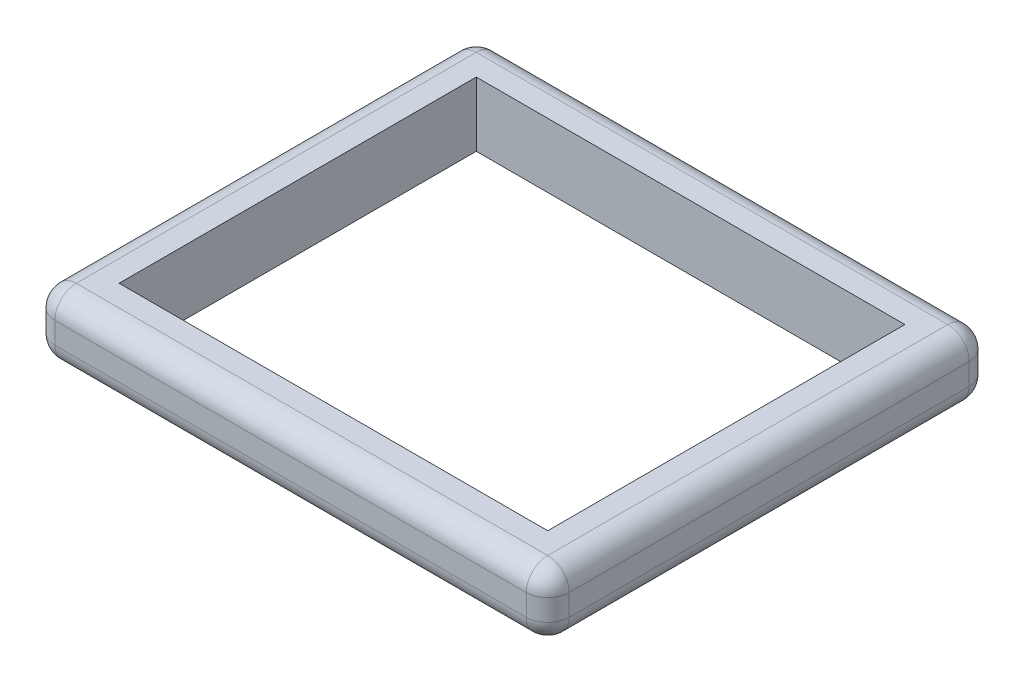
ISO-10303-21;
HEADER;
FILE_DESCRIPTION(('STEP AP214'),'2;1');
FILE_NAME('part.step','',(''),(''),'','','');
FILE_SCHEMA(('AUTOMOTIVE_DESIGN { 1 0 10303 214 1 1 1 1 }'));
ENDSEC;
DATA;
#1=APPLICATION_CONTEXT('core data for automotive mechanical design processes');
#2=APPLICATION_PROTOCOL_DEFINITION('international standard','automotive_design',2000,#1);
#3=PRODUCT_CONTEXT('',#1,'mechanical');
#4=PRODUCT('Part','Part','',(#3));
#5=PRODUCT_RELATED_PRODUCT_CATEGORY('part','',(#4));
#6=PRODUCT_DEFINITION_FORMATION('','',#4);
#7=PRODUCT_DEFINITION_CONTEXT('part definition',#1,'design');
#8=PRODUCT_DEFINITION('design','',#6,#7);
#9=PRODUCT_DEFINITION_SHAPE('','',#8);
#10=(LENGTH_UNIT() NAMED_UNIT(*) SI_UNIT(.MILLI.,.METRE.));
#11=(NAMED_UNIT(*) PLANE_ANGLE_UNIT() SI_UNIT($,.RADIAN.));
#12=(NAMED_UNIT(*) SI_UNIT($,.STERADIAN.) SOLID_ANGLE_UNIT());
#13=UNCERTAINTY_MEASURE_WITH_UNIT(LENGTH_MEASURE(1.E-05),#10,'distance_accuracy_value','');
#14=(GEOMETRIC_REPRESENTATION_CONTEXT(3) GLOBAL_UNCERTAINTY_ASSIGNED_CONTEXT((#13)) GLOBAL_UNIT_ASSIGNED_CONTEXT((#10,
#11,#12)) REPRESENTATION_CONTEXT('',''));
#15=CARTESIAN_POINT('',(0.,0.,0.));
#16=DIRECTION('',(0.,0.,1.));
#17=DIRECTION('',(1.,0.,0.));
#18=AXIS2_PLACEMENT_3D('',#15,#16,#17);
#19=CARTESIAN_POINT('',(0.,114.3,0.));
#20=DIRECTION('',(0.,1.,0.));
#21=DIRECTION('',(0.,0.,1.));
#22=AXIS2_PLACEMENT_3D('',#19,#20,#21);
#23=PLANE('',#22);
#24=DIRECTION('',(0.,0.,1.));
#25=VECTOR('',#24,1.);
#26=CARTESIAN_POINT('',(-419.1,114.3,355.6));
#27=LINE('',#26,#25);
#28=CARTESIAN_POINT('',(-419.1,114.3,-355.6));
#29=VERTEX_POINT('',#28);
#30=CARTESIAN_POINT('',(-419.1,114.3,355.6));
#31=VERTEX_POINT('',#30);
#32=EDGE_CURVE('E221',#29,#31,#27,.T.);
#33=ORIENTED_EDGE('',*,*,#32,.T.);
#34=DIRECTION('',(1.,0.,0.));
#35=VECTOR('',#34,1.);
#36=CARTESIAN_POINT('',(419.1,114.3,355.6));
#37=LINE('',#36,#35);
#38=CARTESIAN_POINT('',(419.1,114.3,355.6));
#39=VERTEX_POINT('',#38);
#40=EDGE_CURVE('E223',#31,#39,#37,.T.);
#41=ORIENTED_EDGE('',*,*,#40,.T.);
#42=DIRECTION('',(0.,0.,-1.));
#43=VECTOR('',#42,1.);
#44=CARTESIAN_POINT('',(419.1,114.3,-355.6));
#45=LINE('',#44,#43);
#46=CARTESIAN_POINT('',(419.1,114.3,-355.6));
#47=VERTEX_POINT('',#46);
#48=EDGE_CURVE('E217',#39,#47,#45,.T.);
#49=ORIENTED_EDGE('',*,*,#48,.T.);
#50=DIRECTION('',(-1.,0.,0.));
#51=VECTOR('',#50,1.);
#52=CARTESIAN_POINT('',(-419.1,114.3,-355.6));
#53=LINE('',#52,#51);
#54=EDGE_CURVE('E219',#47,#29,#53,.T.);
#55=ORIENTED_EDGE('',*,*,#54,.T.);
#56=EDGE_LOOP('',(#33,#41,#49,#55));
#57=FACE_BOUND('',#56,.T.);
#58=DIRECTION('',(-1.,0.,0.));
#59=VECTOR('',#58,1.);
#60=CARTESIAN_POINT('',(-381.,114.3,-317.5));
#61=LINE('',#60,#59);
#62=CARTESIAN_POINT('',(381.,114.3,-317.5));
#63=VERTEX_POINT('',#62);
#64=CARTESIAN_POINT('',(-381.,114.3,-317.5));
#65=VERTEX_POINT('',#64);
#66=EDGE_CURVE('E165',#63,#65,#61,.T.);
#67=ORIENTED_EDGE('',*,*,#66,.F.);
#68=DIRECTION('',(0.,0.,-1.));
#69=VECTOR('',#68,1.);
#70=CARTESIAN_POINT('',(381.,114.3,-317.5));
#71=LINE('',#70,#69);
#72=CARTESIAN_POINT('',(381.,114.3,317.5));
#73=VERTEX_POINT('',#72);
#74=EDGE_CURVE('E155',#73,#63,#71,.T.);
#75=ORIENTED_EDGE('',*,*,#74,.F.);
#76=DIRECTION('',(1.,0.,0.));
#77=VECTOR('',#76,1.);
#78=CARTESIAN_POINT('',(-381.,114.3,317.5));
#79=LINE('',#78,#77);
#80=CARTESIAN_POINT('',(-381.,114.3,317.5));
#81=VERTEX_POINT('',#80);
#82=EDGE_CURVE('E180',#81,#73,#79,.T.);
#83=ORIENTED_EDGE('',*,*,#82,.F.);
#84=DIRECTION('',(0.,0.,1.));
#85=VECTOR('',#84,1.);
#86=CARTESIAN_POINT('',(-381.,114.3,-317.5));
#87=LINE('',#86,#85);
#88=EDGE_CURVE('E178',#65,#81,#87,.T.);
#89=ORIENTED_EDGE('',*,*,#88,.F.);
#90=EDGE_LOOP('',(#67,#75,#83,#89));
#91=FACE_BOUND('',#90,.T.);
#92=ADVANCED_FACE('F40',(#57,#91),#23,.T.);
#93=CARTESIAN_POINT('',(0.,0.,0.));
#94=DIRECTION('',(0.,1.,0.));
#95=DIRECTION('',(0.,0.,1.));
#96=AXIS2_PLACEMENT_3D('',#93,#94,#95);
#97=PLANE('',#96);
#98=DIRECTION('',(0.,0.,-1.));
#99=VECTOR('',#98,1.);
#100=CARTESIAN_POINT('',(419.1,0.,0.));
#101=LINE('',#100,#99);
#102=CARTESIAN_POINT('',(419.1,0.,-355.6));
#103=VERTEX_POINT('',#102);
#104=CARTESIAN_POINT('',(419.1,0.,355.6));
#105=VERTEX_POINT('',#104);
#106=EDGE_CURVE('E270',#103,#105,#101,.F.);
#107=ORIENTED_EDGE('',*,*,#106,.T.);
#108=DIRECTION('',(1.,0.,0.));
#109=VECTOR('',#108,1.);
#110=CARTESIAN_POINT('',(0.,0.,355.6));
#111=LINE('',#110,#109);
#112=CARTESIAN_POINT('',(-419.1,0.,355.6));
#113=VERTEX_POINT('',#112);
#114=EDGE_CURVE('E276',#105,#113,#111,.F.);
#115=ORIENTED_EDGE('',*,*,#114,.T.);
#116=DIRECTION('',(0.,0.,1.));
#117=VECTOR('',#116,1.);
#118=CARTESIAN_POINT('',(-419.1,0.,0.));
#119=LINE('',#118,#117);
#120=CARTESIAN_POINT('',(-419.1,0.,-355.6));
#121=VERTEX_POINT('',#120);
#122=EDGE_CURVE('E274',#113,#121,#119,.F.);
#123=ORIENTED_EDGE('',*,*,#122,.T.);
#124=DIRECTION('',(-1.,0.,0.));
#125=VECTOR('',#124,1.);
#126=CARTESIAN_POINT('',(0.,0.,-355.6));
#127=LINE('',#126,#125);
#128=EDGE_CURVE('E272',#121,#103,#127,.F.);
#129=ORIENTED_EDGE('',*,*,#128,.T.);
#130=EDGE_LOOP('',(#107,#115,#123,#129));
#131=FACE_BOUND('',#130,.T.);
#132=DIRECTION('',(0.,0.,-1.));
#133=VECTOR('',#132,1.);
#134=CARTESIAN_POINT('',(381.,0.,-317.5));
#135=LINE('',#134,#133);
#136=CARTESIAN_POINT('',(381.,0.,317.5));
#137=VERTEX_POINT('',#136);
#138=CARTESIAN_POINT('',(381.,0.,-317.5));
#139=VERTEX_POINT('',#138);
#140=EDGE_CURVE('E184',#137,#139,#135,.T.);
#141=ORIENTED_EDGE('',*,*,#140,.T.);
#142=DIRECTION('',(-1.,0.,0.));
#143=VECTOR('',#142,1.);
#144=CARTESIAN_POINT('',(-381.,0.,-317.5));
#145=LINE('',#144,#143);
#146=CARTESIAN_POINT('',(-381.,0.,-317.5));
#147=VERTEX_POINT('',#146);
#148=EDGE_CURVE('E172',#139,#147,#145,.T.);
#149=ORIENTED_EDGE('',*,*,#148,.T.);
#150=DIRECTION('',(0.,0.,1.));
#151=VECTOR('',#150,1.);
#152=CARTESIAN_POINT('',(-381.,0.,-317.5));
#153=LINE('',#152,#151);
#154=CARTESIAN_POINT('',(-381.,0.,317.5));
#155=VERTEX_POINT('',#154);
#156=EDGE_CURVE('E188',#147,#155,#153,.T.);
#157=ORIENTED_EDGE('',*,*,#156,.T.);
#158=DIRECTION('',(1.,0.,0.));
#159=VECTOR('',#158,1.);
#160=CARTESIAN_POINT('',(-381.,0.,317.5));
#161=LINE('',#160,#159);
#162=EDGE_CURVE('E166',#155,#137,#161,.T.);
#163=ORIENTED_EDGE('',*,*,#162,.T.);
#164=EDGE_LOOP('',(#141,#149,#157,#163));
#165=FACE_BOUND('',#164,.T.);
#166=ADVANCED_FACE('F362',(#131,#165),#97,.F.);
#167=CARTESIAN_POINT('',(457.2,114.3,-393.7));
#168=DIRECTION('',(-1.,0.,0.));
#169=DIRECTION('',(0.,0.,1.));
#170=AXIS2_PLACEMENT_3D('',#167,#168,#169);
#171=PLANE('',#170);
#172=DIRECTION('',(0.,-1.,0.));
#173=VECTOR('',#172,1.);
#174=CARTESIAN_POINT('',(457.2,114.3,355.6));
#175=LINE('',#174,#173);
#176=CARTESIAN_POINT('',(457.2,76.2,355.6));
#177=VERTEX_POINT('',#176);
#178=CARTESIAN_POINT('',(457.2,38.1,355.6));
#179=VERTEX_POINT('',#178);
#180=EDGE_CURVE('E198',#177,#179,#175,.T.);
#181=ORIENTED_EDGE('',*,*,#180,.T.);
#182=DIRECTION('',(0.,0.,-1.));
#183=VECTOR('',#182,1.);
#184=CARTESIAN_POINT('',(457.2,38.1,-393.7));
#185=LINE('',#184,#183);
#186=CARTESIAN_POINT('',(457.2,38.1,-355.6));
#187=VERTEX_POINT('',#186);
#188=EDGE_CURVE('E11',#179,#187,#185,.T.);
#189=ORIENTED_EDGE('',*,*,#188,.T.);
#190=DIRECTION('',(0.,-1.,0.));
#191=VECTOR('',#190,1.);
#192=CARTESIAN_POINT('',(457.2,114.3,-355.6));
#193=LINE('',#192,#191);
#194=CARTESIAN_POINT('',(457.2,76.2,-355.6));
#195=VERTEX_POINT('',#194);
#196=EDGE_CURVE('E173',#187,#195,#193,.F.);
#197=ORIENTED_EDGE('',*,*,#196,.T.);
#198=DIRECTION('',(0.,0.,-1.));
#199=VECTOR('',#198,1.);
#200=CARTESIAN_POINT('',(457.2,76.2,355.6));
#201=LINE('',#200,#199);
#202=EDGE_CURVE('E241',#195,#177,#201,.F.);
#203=ORIENTED_EDGE('',*,*,#202,.T.);
#204=EDGE_LOOP('',(#181,#189,#197,#203));
#205=FACE_BOUND('',#204,.T.);
#206=ADVANCED_FACE('F368',(#205),#171,.F.);
#207=CARTESIAN_POINT('',(-457.2,114.3,-393.7));
#208=DIRECTION('',(0.,0.,1.));
#209=DIRECTION('',(1.,0.,0.));
#210=AXIS2_PLACEMENT_3D('',#207,#208,#209);
#211=PLANE('',#210);
#212=DIRECTION('',(0.,-1.,0.));
#213=VECTOR('',#212,1.);
#214=CARTESIAN_POINT('',(419.1,114.3,-393.7));
#215=LINE('',#214,#213);
#216=CARTESIAN_POINT('',(419.1,76.2,-393.7));
#217=VERTEX_POINT('',#216);
#218=CARTESIAN_POINT('',(419.1,38.1,-393.7));
#219=VERTEX_POINT('',#218);
#220=EDGE_CURVE('E210',#217,#219,#215,.T.);
#221=ORIENTED_EDGE('',*,*,#220,.T.);
#222=DIRECTION('',(-1.,0.,0.));
#223=VECTOR('',#222,1.);
#224=CARTESIAN_POINT('',(-457.2,38.1,-393.7));
#225=LINE('',#224,#223);
#226=CARTESIAN_POINT('',(-419.1,38.1,-393.7));
#227=VERTEX_POINT('',#226);
#228=EDGE_CURVE('E285',#219,#227,#225,.T.);
#229=ORIENTED_EDGE('',*,*,#228,.T.);
#230=DIRECTION('',(0.,-1.,0.));
#231=VECTOR('',#230,1.);
#232=CARTESIAN_POINT('',(-419.1,114.3,-393.7));
#233=LINE('',#232,#231);
#234=CARTESIAN_POINT('',(-419.1,76.2,-393.7));
#235=VERTEX_POINT('',#234);
#236=EDGE_CURVE('E212',#227,#235,#233,.F.);
#237=ORIENTED_EDGE('',*,*,#236,.T.);
#238=DIRECTION('',(-1.,0.,0.));
#239=VECTOR('',#238,1.);
#240=CARTESIAN_POINT('',(419.1,76.2,-393.7));
#241=LINE('',#240,#239);
#242=EDGE_CURVE('E236',#235,#217,#241,.F.);
#243=ORIENTED_EDGE('',*,*,#242,.T.);
#244=EDGE_LOOP('',(#221,#229,#237,#243));
#245=FACE_BOUND('',#244,.T.);
#246=ADVANCED_FACE('F380',(#245),#211,.F.);
#247=CARTESIAN_POINT('',(-457.2,114.3,-393.7));
#248=DIRECTION('',(1.,0.,0.));
#249=DIRECTION('',(0.,0.,-1.));
#250=AXIS2_PLACEMENT_3D('',#247,#248,#249);
#251=PLANE('',#250);
#252=DIRECTION('',(0.,-1.,0.));
#253=VECTOR('',#252,1.);
#254=CARTESIAN_POINT('',(-457.2,114.3,-355.6));
#255=LINE('',#254,#253);
#256=CARTESIAN_POINT('',(-457.2,76.2,-355.6));
#257=VERTEX_POINT('',#256);
#258=CARTESIAN_POINT('',(-457.2,38.1,-355.6));
#259=VERTEX_POINT('',#258);
#260=EDGE_CURVE('E205',#257,#259,#255,.T.);
#261=ORIENTED_EDGE('',*,*,#260,.T.);
#262=DIRECTION('',(0.,0.,1.));
#263=VECTOR('',#262,1.);
#264=CARTESIAN_POINT('',(-457.2,38.1,-393.7));
#265=LINE('',#264,#263);
#266=CARTESIAN_POINT('',(-457.2,38.1,355.6));
#267=VERTEX_POINT('',#266);
#268=EDGE_CURVE('E281',#259,#267,#265,.T.);
#269=ORIENTED_EDGE('',*,*,#268,.T.);
#270=DIRECTION('',(0.,-1.,0.));
#271=VECTOR('',#270,1.);
#272=CARTESIAN_POINT('',(-457.2,114.3,355.6));
#273=LINE('',#272,#271);
#274=CARTESIAN_POINT('',(-457.2,76.2,355.6));
#275=VERTEX_POINT('',#274);
#276=EDGE_CURVE('E208',#267,#275,#273,.F.);
#277=ORIENTED_EDGE('',*,*,#276,.T.);
#278=DIRECTION('',(0.,0.,1.));
#279=VECTOR('',#278,1.);
#280=CARTESIAN_POINT('',(-457.2,76.2,-355.6));
#281=LINE('',#280,#279);
#282=EDGE_CURVE('E231',#275,#257,#281,.F.);
#283=ORIENTED_EDGE('',*,*,#282,.T.);
#284=EDGE_LOOP('',(#261,#269,#277,#283));
#285=FACE_BOUND('',#284,.T.);
#286=ADVANCED_FACE('F324',(#285),#251,.F.);
#287=CARTESIAN_POINT('',(-457.2,114.3,393.7));
#288=DIRECTION('',(0.,0.,-1.));
#289=DIRECTION('',(-1.,0.,0.));
#290=AXIS2_PLACEMENT_3D('',#287,#288,#289);
#291=PLANE('',#290);
#292=DIRECTION('',(0.,-1.,0.));
#293=VECTOR('',#292,1.);
#294=CARTESIAN_POINT('',(-419.1,114.3,393.7));
#295=LINE('',#294,#293);
#296=CARTESIAN_POINT('',(-419.1,76.2,393.7));
#297=VERTEX_POINT('',#296);
#298=CARTESIAN_POINT('',(-419.1,38.1,393.7));
#299=VERTEX_POINT('',#298);
#300=EDGE_CURVE('E200',#297,#299,#295,.T.);
#301=ORIENTED_EDGE('',*,*,#300,.T.);
#302=DIRECTION('',(1.,0.,0.));
#303=VECTOR('',#302,1.);
#304=CARTESIAN_POINT('',(-457.2,38.1,393.7));
#305=LINE('',#304,#303);
#306=CARTESIAN_POINT('',(419.1,38.1,393.7));
#307=VERTEX_POINT('',#306);
#308=EDGE_CURVE('E268',#299,#307,#305,.T.);
#309=ORIENTED_EDGE('',*,*,#308,.T.);
#310=DIRECTION('',(0.,-1.,0.));
#311=VECTOR('',#310,1.);
#312=CARTESIAN_POINT('',(419.1,114.3,393.7));
#313=LINE('',#312,#311);
#314=CARTESIAN_POINT('',(419.1,76.2,393.7));
#315=VERTEX_POINT('',#314);
#316=EDGE_CURVE('E203',#307,#315,#313,.F.);
#317=ORIENTED_EDGE('',*,*,#316,.T.);
#318=DIRECTION('',(1.,0.,0.));
#319=VECTOR('',#318,1.);
#320=CARTESIAN_POINT('',(-419.1,76.2,393.7));
#321=LINE('',#320,#319);
#322=EDGE_CURVE('E226',#315,#297,#321,.F.);
#323=ORIENTED_EDGE('',*,*,#322,.T.);
#324=EDGE_LOOP('',(#301,#309,#317,#323));
#325=FACE_BOUND('',#324,.T.);
#326=ADVANCED_FACE('F374',(#325),#291,.F.);
#327=CARTESIAN_POINT('',(381.,114.3,-317.5));
#328=DIRECTION('',(-1.,0.,0.));
#329=DIRECTION('',(0.,0.,1.));
#330=AXIS2_PLACEMENT_3D('',#327,#328,#329);
#331=PLANE('',#330);
#332=ORIENTED_EDGE('',*,*,#140,.F.);
#333=DIRECTION('',(0.,-1.,0.));
#334=VECTOR('',#333,1.);
#335=CARTESIAN_POINT('',(381.,114.3,317.5));
#336=LINE('',#335,#334);
#337=EDGE_CURVE('E161',#73,#137,#336,.T.);
#338=ORIENTED_EDGE('',*,*,#337,.F.);
#339=ORIENTED_EDGE('',*,*,#74,.T.);
#340=DIRECTION('',(0.,-1.,0.));
#341=VECTOR('',#340,1.);
#342=CARTESIAN_POINT('',(381.,114.3,-317.5));
#343=LINE('',#342,#341);
#344=EDGE_CURVE('E158',#63,#139,#343,.T.);
#345=ORIENTED_EDGE('',*,*,#344,.T.);
#346=EDGE_LOOP('',(#332,#338,#339,#345));
#347=FACE_BOUND('',#346,.T.);
#348=ADVANCED_FACE('F157',(#347),#331,.T.);
#349=CARTESIAN_POINT('',(-381.,114.3,-317.5));
#350=DIRECTION('',(0.,0.,1.));
#351=DIRECTION('',(1.,0.,0.));
#352=AXIS2_PLACEMENT_3D('',#349,#350,#351);
#353=PLANE('',#352);
#354=ORIENTED_EDGE('',*,*,#148,.F.);
#355=ORIENTED_EDGE('',*,*,#344,.F.);
#356=ORIENTED_EDGE('',*,*,#66,.T.);
#357=DIRECTION('',(0.,-1.,0.));
#358=VECTOR('',#357,1.);
#359=CARTESIAN_POINT('',(-381.,114.3,-317.5));
#360=LINE('',#359,#358);
#361=EDGE_CURVE('E174',#65,#147,#360,.T.);
#362=ORIENTED_EDGE('',*,*,#361,.T.);
#363=EDGE_LOOP('',(#354,#355,#356,#362));
#364=FACE_BOUND('',#363,.T.);
#365=ADVANCED_FACE('F169',(#364),#353,.T.);
#366=CARTESIAN_POINT('',(-381.,114.3,-317.5));
#367=DIRECTION('',(1.,0.,0.));
#368=DIRECTION('',(0.,0.,-1.));
#369=AXIS2_PLACEMENT_3D('',#366,#367,#368);
#370=PLANE('',#369);
#371=ORIENTED_EDGE('',*,*,#156,.F.);
#372=ORIENTED_EDGE('',*,*,#361,.F.);
#373=ORIENTED_EDGE('',*,*,#88,.T.);
#374=DIRECTION('',(0.,-1.,0.));
#375=VECTOR('',#374,1.);
#376=CARTESIAN_POINT('',(-381.,114.3,317.5));
#377=LINE('',#376,#375);
#378=EDGE_CURVE('E194',#81,#155,#377,.T.);
#379=ORIENTED_EDGE('',*,*,#378,.T.);
#380=EDGE_LOOP('',(#371,#372,#373,#379));
#381=FACE_BOUND('',#380,.T.);
#382=ADVANCED_FACE('F602',(#381),#370,.T.);
#383=CARTESIAN_POINT('',(-381.,114.3,317.5));
#384=DIRECTION('',(0.,0.,-1.));
#385=DIRECTION('',(-1.,0.,0.));
#386=AXIS2_PLACEMENT_3D('',#383,#384,#385);
#387=PLANE('',#386);
#388=ORIENTED_EDGE('',*,*,#162,.F.);
#389=ORIENTED_EDGE('',*,*,#378,.F.);
#390=ORIENTED_EDGE('',*,*,#82,.T.);
#391=ORIENTED_EDGE('',*,*,#337,.T.);
#392=EDGE_LOOP('',(#388,#389,#390,#391));
#393=FACE_BOUND('',#392,.T.);
#394=ADVANCED_FACE('F390',(#393),#387,.T.);
#395=CARTESIAN_POINT('',(419.1,114.3,355.6));
#396=DIRECTION('',(0.,-1.,0.));
#397=DIRECTION('',(0.,0.,-1.));
#398=AXIS2_PLACEMENT_3D('',#395,#396,#397);
#399=CYLINDRICAL_SURFACE('',#398,38.1);
#400=ORIENTED_EDGE('',*,*,#316,.F.);
#401=CARTESIAN_POINT('',(419.1,38.1,355.6));
#402=DIRECTION('',(0.,-1.,0.));
#403=DIRECTION('',(0.,0.,-1.));
#404=AXIS2_PLACEMENT_3D('',#401,#402,#403);
#405=CIRCLE('',#404,38.1);
#406=EDGE_CURVE('E243',#307,#179,#405,.F.);
#407=ORIENTED_EDGE('',*,*,#406,.T.);
#408=ORIENTED_EDGE('',*,*,#180,.F.);
#409=CARTESIAN_POINT('',(419.1,76.2,355.6));
#410=DIRECTION('',(0.,-1.,0.));
#411=DIRECTION('',(0.,0.,-1.));
#412=AXIS2_PLACEMENT_3D('',#409,#410,#411);
#413=CIRCLE('',#412,38.1);
#414=EDGE_CURVE('E214',#177,#315,#413,.T.);
#415=ORIENTED_EDGE('',*,*,#414,.T.);
#416=EDGE_LOOP('',(#400,#407,#408,#415));
#417=FACE_BOUND('',#416,.T.);
#418=ADVANCED_FACE('F386',(#417),#399,.T.);
#419=CARTESIAN_POINT('',(-419.1,114.3,355.6));
#420=DIRECTION('',(0.,-1.,0.));
#421=DIRECTION('',(0.,0.,-1.));
#422=AXIS2_PLACEMENT_3D('',#419,#420,#421);
#423=CYLINDRICAL_SURFACE('',#422,38.1);
#424=ORIENTED_EDGE('',*,*,#276,.F.);
#425=CARTESIAN_POINT('',(-419.1,38.1,355.6));
#426=DIRECTION('',(0.,-1.,0.));
#427=DIRECTION('',(0.,0.,-1.));
#428=AXIS2_PLACEMENT_3D('',#425,#426,#427);
#429=CIRCLE('',#428,38.1);
#430=EDGE_CURVE('E279',#267,#299,#429,.F.);
#431=ORIENTED_EDGE('',*,*,#430,.T.);
#432=ORIENTED_EDGE('',*,*,#300,.F.);
#433=CARTESIAN_POINT('',(-419.1,76.2,355.6));
#434=DIRECTION('',(0.,-1.,0.));
#435=DIRECTION('',(0.,0.,-1.));
#436=AXIS2_PLACEMENT_3D('',#433,#434,#435);
#437=CIRCLE('',#436,38.1);
#438=EDGE_CURVE('E228',#297,#275,#437,.T.);
#439=ORIENTED_EDGE('',*,*,#438,.T.);
#440=EDGE_LOOP('',(#424,#431,#432,#439));
#441=FACE_BOUND('',#440,.T.);
#442=ADVANCED_FACE('F389',(#441),#423,.T.);
#443=CARTESIAN_POINT('',(-419.1,114.3,-355.6));
#444=DIRECTION('',(0.,-1.,0.));
#445=DIRECTION('',(0.,0.,-1.));
#446=AXIS2_PLACEMENT_3D('',#443,#444,#445);
#447=CYLINDRICAL_SURFACE('',#446,38.1);
#448=ORIENTED_EDGE('',*,*,#236,.F.);
#449=CARTESIAN_POINT('',(-419.1,38.1,-355.6));
#450=DIRECTION('',(0.,-1.,0.));
#451=DIRECTION('',(0.,0.,-1.));
#452=AXIS2_PLACEMENT_3D('',#449,#450,#451);
#453=CIRCLE('',#452,38.1);
#454=EDGE_CURVE('E283',#227,#259,#453,.F.);
#455=ORIENTED_EDGE('',*,*,#454,.T.);
#456=ORIENTED_EDGE('',*,*,#260,.F.);
#457=CARTESIAN_POINT('',(-419.1,76.2,-355.6));
#458=DIRECTION('',(0.,-1.,0.));
#459=DIRECTION('',(0.,0.,-1.));
#460=AXIS2_PLACEMENT_3D('',#457,#458,#459);
#461=CIRCLE('',#460,38.1);
#462=EDGE_CURVE('E233',#257,#235,#461,.T.);
#463=ORIENTED_EDGE('',*,*,#462,.T.);
#464=EDGE_LOOP('',(#448,#455,#456,#463));
#465=FACE_BOUND('',#464,.T.);
#466=ADVANCED_FACE('F321',(#465),#447,.T.);
#467=CARTESIAN_POINT('',(419.1,114.3,-355.6));
#468=DIRECTION('',(0.,-1.,0.));
#469=DIRECTION('',(0.,0.,-1.));
#470=AXIS2_PLACEMENT_3D('',#467,#468,#469);
#471=CYLINDRICAL_SURFACE('',#470,38.1);
#472=ORIENTED_EDGE('',*,*,#196,.F.);
#473=CARTESIAN_POINT('',(419.1,38.1,-355.6));
#474=DIRECTION('',(0.,-1.,0.));
#475=DIRECTION('',(0.,0.,-1.));
#476=AXIS2_PLACEMENT_3D('',#473,#474,#475);
#477=CIRCLE('',#476,38.1);
#478=EDGE_CURVE('E49',#187,#219,#477,.F.);
#479=ORIENTED_EDGE('',*,*,#478,.T.);
#480=ORIENTED_EDGE('',*,*,#220,.F.);
#481=CARTESIAN_POINT('',(419.1,76.2,-355.6));
#482=DIRECTION('',(0.,-1.,0.));
#483=DIRECTION('',(0.,0.,-1.));
#484=AXIS2_PLACEMENT_3D('',#481,#482,#483);
#485=CIRCLE('',#484,38.1);
#486=EDGE_CURVE('E238',#217,#195,#485,.T.);
#487=ORIENTED_EDGE('',*,*,#486,.T.);
#488=EDGE_LOOP('',(#472,#479,#480,#487));
#489=FACE_BOUND('',#488,.T.);
#490=ADVANCED_FACE('F352',(#489),#471,.T.);
#491=CARTESIAN_POINT('',(-419.1,76.2,-355.6));
#492=DIRECTION('',(0.,1.,0.));
#493=DIRECTION('',(0.,0.,1.));
#494=AXIS2_PLACEMENT_3D('',#491,#492,#493);
#495=SPHERICAL_SURFACE('',#494,38.1);
#496=CARTESIAN_POINT('',(-419.1,76.2,-355.6));
#497=DIRECTION('',(1.,0.,0.));
#498=DIRECTION('',(0.,0.,-1.));
#499=AXIS2_PLACEMENT_3D('',#496,#497,#498);
#500=CIRCLE('',#499,38.1);
#501=EDGE_CURVE('E261',#235,#29,#500,.T.);
#502=ORIENTED_EDGE('',*,*,#501,.F.);
#503=ORIENTED_EDGE('',*,*,#462,.F.);
#504=CARTESIAN_POINT('',(-419.1,76.2,-355.6));
#505=DIRECTION('',(0.,0.,1.));
#506=DIRECTION('',(1.,0.,0.));
#507=AXIS2_PLACEMENT_3D('',#504,#505,#506);
#508=CIRCLE('',#507,38.1);
#509=EDGE_CURVE('E186',#29,#257,#508,.T.);
#510=ORIENTED_EDGE('',*,*,#509,.F.);
#511=EDGE_LOOP('',(#502,#503,#510));
#512=FACE_BOUND('',#511,.T.);
#513=ADVANCED_FACE('F350',(#512),#495,.T.);
#514=CARTESIAN_POINT('',(-419.1,76.2,0.));
#515=DIRECTION('',(0.,0.,-1.));
#516=DIRECTION('',(-1.,0.,0.));
#517=AXIS2_PLACEMENT_3D('',#514,#515,#516);
#518=CYLINDRICAL_SURFACE('',#517,38.1);
#519=ORIENTED_EDGE('',*,*,#509,.T.);
#520=ORIENTED_EDGE('',*,*,#282,.F.);
#521=CARTESIAN_POINT('',(-419.1,76.2,355.6));
#522=DIRECTION('',(0.,0.,1.));
#523=DIRECTION('',(1.,0.,0.));
#524=AXIS2_PLACEMENT_3D('',#521,#522,#523);
#525=CIRCLE('',#524,38.1);
#526=EDGE_CURVE('E258',#31,#275,#525,.T.);
#527=ORIENTED_EDGE('',*,*,#526,.F.);
#528=ORIENTED_EDGE('',*,*,#32,.F.);
#529=EDGE_LOOP('',(#519,#520,#527,#528));
#530=FACE_BOUND('',#529,.T.);
#531=ADVANCED_FACE('F329',(#530),#518,.T.);
#532=CARTESIAN_POINT('',(0.,76.2,-355.6));
#533=DIRECTION('',(1.,0.,0.));
#534=DIRECTION('',(0.,0.,-1.));
#535=AXIS2_PLACEMENT_3D('',#532,#533,#534);
#536=CYLINDRICAL_SURFACE('',#535,38.1);
#537=ORIENTED_EDGE('',*,*,#501,.T.);
#538=ORIENTED_EDGE('',*,*,#54,.F.);
#539=CARTESIAN_POINT('',(419.1,76.2,-355.6));
#540=DIRECTION('',(1.,0.,0.));
#541=DIRECTION('',(0.,0.,-1.));
#542=AXIS2_PLACEMENT_3D('',#539,#540,#541);
#543=CIRCLE('',#542,38.1);
#544=EDGE_CURVE('E255',#217,#47,#543,.T.);
#545=ORIENTED_EDGE('',*,*,#544,.F.);
#546=ORIENTED_EDGE('',*,*,#242,.F.);
#547=EDGE_LOOP('',(#537,#538,#545,#546));
#548=FACE_BOUND('',#547,.T.);
#549=ADVANCED_FACE('F348',(#548),#536,.T.);
#550=CARTESIAN_POINT('',(-419.1,76.2,355.6));
#551=DIRECTION('',(0.,1.,0.));
#552=DIRECTION('',(0.,0.,1.));
#553=AXIS2_PLACEMENT_3D('',#550,#551,#552);
#554=SPHERICAL_SURFACE('',#553,38.1);
#555=ORIENTED_EDGE('',*,*,#526,.T.);
#556=ORIENTED_EDGE('',*,*,#438,.F.);
#557=CARTESIAN_POINT('',(-419.1,76.2,355.6));
#558=DIRECTION('',(1.,0.,0.));
#559=DIRECTION('',(0.,0.,-1.));
#560=AXIS2_PLACEMENT_3D('',#557,#558,#559);
#561=CIRCLE('',#560,38.1);
#562=EDGE_CURVE('E252',#31,#297,#561,.T.);
#563=ORIENTED_EDGE('',*,*,#562,.F.);
#564=EDGE_LOOP('',(#555,#556,#563));
#565=FACE_BOUND('',#564,.T.);
#566=ADVANCED_FACE('F335',(#565),#554,.T.);
#567=CARTESIAN_POINT('',(419.1,76.2,-355.6));
#568=DIRECTION('',(0.,1.,0.));
#569=DIRECTION('',(0.,0.,1.));
#570=AXIS2_PLACEMENT_3D('',#567,#568,#569);
#571=SPHERICAL_SURFACE('',#570,38.1);
#572=ORIENTED_EDGE('',*,*,#486,.F.);
#573=ORIENTED_EDGE('',*,*,#544,.T.);
#574=CARTESIAN_POINT('',(419.1,76.2,-355.6));
#575=DIRECTION('',(0.,0.,1.));
#576=DIRECTION('',(1.,0.,0.));
#577=AXIS2_PLACEMENT_3D('',#574,#575,#576);
#578=CIRCLE('',#577,38.1);
#579=EDGE_CURVE('E249',#195,#47,#578,.T.);
#580=ORIENTED_EDGE('',*,*,#579,.F.);
#581=EDGE_LOOP('',(#572,#573,#580));
#582=FACE_BOUND('',#581,.T.);
#583=ADVANCED_FACE('F407',(#582),#571,.T.);
#584=CARTESIAN_POINT('',(0.,76.2,355.6));
#585=DIRECTION('',(-1.,0.,0.));
#586=DIRECTION('',(0.,0.,1.));
#587=AXIS2_PLACEMENT_3D('',#584,#585,#586);
#588=CYLINDRICAL_SURFACE('',#587,38.1);
#589=ORIENTED_EDGE('',*,*,#562,.T.);
#590=ORIENTED_EDGE('',*,*,#322,.F.);
#591=CARTESIAN_POINT('',(419.1,76.2,355.6));
#592=DIRECTION('',(1.,0.,0.));
#593=DIRECTION('',(0.,0.,-1.));
#594=AXIS2_PLACEMENT_3D('',#591,#592,#593);
#595=CIRCLE('',#594,38.1);
#596=EDGE_CURVE('E246',#39,#315,#595,.T.);
#597=ORIENTED_EDGE('',*,*,#596,.F.);
#598=ORIENTED_EDGE('',*,*,#40,.F.);
#599=EDGE_LOOP('',(#589,#590,#597,#598));
#600=FACE_BOUND('',#599,.T.);
#601=ADVANCED_FACE('F340',(#600),#588,.T.);
#602=CARTESIAN_POINT('',(419.1,76.2,0.));
#603=DIRECTION('',(0.,0.,1.));
#604=DIRECTION('',(1.,0.,0.));
#605=AXIS2_PLACEMENT_3D('',#602,#603,#604);
#606=CYLINDRICAL_SURFACE('',#605,38.1);
#607=ORIENTED_EDGE('',*,*,#579,.T.);
#608=ORIENTED_EDGE('',*,*,#48,.F.);
#609=CARTESIAN_POINT('',(419.1,76.2,355.6));
#610=DIRECTION('',(0.,0.,1.));
#611=DIRECTION('',(1.,0.,0.));
#612=AXIS2_PLACEMENT_3D('',#609,#610,#611);
#613=CIRCLE('',#612,38.1);
#614=EDGE_CURVE('E244',#177,#39,#613,.T.);
#615=ORIENTED_EDGE('',*,*,#614,.F.);
#616=ORIENTED_EDGE('',*,*,#202,.F.);
#617=EDGE_LOOP('',(#607,#608,#615,#616));
#618=FACE_BOUND('',#617,.T.);
#619=ADVANCED_FACE('F400',(#618),#606,.T.);
#620=CARTESIAN_POINT('',(419.1,76.2,355.6));
#621=DIRECTION('',(0.,1.,0.));
#622=DIRECTION('',(0.,0.,1.));
#623=AXIS2_PLACEMENT_3D('',#620,#621,#622);
#624=SPHERICAL_SURFACE('',#623,38.1);
#625=ORIENTED_EDGE('',*,*,#596,.T.);
#626=ORIENTED_EDGE('',*,*,#414,.F.);
#627=ORIENTED_EDGE('',*,*,#614,.T.);
#628=EDGE_LOOP('',(#625,#626,#627));
#629=FACE_BOUND('',#628,.T.);
#630=ADVANCED_FACE('F397',(#629),#624,.T.);
#631=CARTESIAN_POINT('',(-419.1,38.1,-355.6));
#632=DIRECTION('',(0.,1.,0.));
#633=DIRECTION('',(0.,0.,1.));
#634=AXIS2_PLACEMENT_3D('',#631,#632,#633);
#635=SPHERICAL_SURFACE('',#634,38.1);
#636=CARTESIAN_POINT('',(-419.1,38.1,-355.6));
#637=DIRECTION('',(0.,0.,1.));
#638=DIRECTION('',(1.,0.,0.));
#639=AXIS2_PLACEMENT_3D('',#636,#637,#638);
#640=CIRCLE('',#639,38.1);
#641=EDGE_CURVE('E303',#259,#121,#640,.T.);
#642=ORIENTED_EDGE('',*,*,#641,.F.);
#643=ORIENTED_EDGE('',*,*,#454,.F.);
#644=CARTESIAN_POINT('',(-419.1,38.1,-355.6));
#645=DIRECTION('',(1.,0.,0.));
#646=DIRECTION('',(0.,0.,-1.));
#647=AXIS2_PLACEMENT_3D('',#644,#645,#646);
#648=CIRCLE('',#647,38.1);
#649=EDGE_CURVE('E44',#121,#227,#648,.T.);
#650=ORIENTED_EDGE('',*,*,#649,.F.);
#651=EDGE_LOOP('',(#642,#643,#650));
#652=FACE_BOUND('',#651,.T.);
#653=ADVANCED_FACE('F42',(#652),#635,.T.);
#654=CARTESIAN_POINT('',(-457.2,38.1,-355.6));
#655=DIRECTION('',(-1.,0.,0.));
#656=DIRECTION('',(0.,0.,1.));
#657=AXIS2_PLACEMENT_3D('',#654,#655,#656);
#658=CYLINDRICAL_SURFACE('',#657,38.1);
#659=ORIENTED_EDGE('',*,*,#649,.T.);
#660=ORIENTED_EDGE('',*,*,#228,.F.);
#661=CARTESIAN_POINT('',(419.1,38.1,-355.6));
#662=DIRECTION('',(1.,0.,0.));
#663=DIRECTION('',(0.,0.,-1.));
#664=AXIS2_PLACEMENT_3D('',#661,#662,#663);
#665=CIRCLE('',#664,38.1);
#666=EDGE_CURVE('E301',#103,#219,#665,.T.);
#667=ORIENTED_EDGE('',*,*,#666,.F.);
#668=ORIENTED_EDGE('',*,*,#128,.F.);
#669=EDGE_LOOP('',(#659,#660,#667,#668));
#670=FACE_BOUND('',#669,.T.);
#671=ADVANCED_FACE('F314',(#670),#658,.T.);
#672=CARTESIAN_POINT('',(-419.1,38.1,-393.7));
#673=DIRECTION('',(0.,0.,1.));
#674=DIRECTION('',(1.,0.,0.));
#675=AXIS2_PLACEMENT_3D('',#672,#673,#674);
#676=CYLINDRICAL_SURFACE('',#675,38.1);
#677=ORIENTED_EDGE('',*,*,#641,.T.);
#678=ORIENTED_EDGE('',*,*,#122,.F.);
#679=CARTESIAN_POINT('',(-419.1,38.1,355.6));
#680=DIRECTION('',(0.,0.,1.));
#681=DIRECTION('',(1.,0.,0.));
#682=AXIS2_PLACEMENT_3D('',#679,#680,#681);
#683=CIRCLE('',#682,38.1);
#684=EDGE_CURVE('E298',#267,#113,#683,.T.);
#685=ORIENTED_EDGE('',*,*,#684,.F.);
#686=ORIENTED_EDGE('',*,*,#268,.F.);
#687=EDGE_LOOP('',(#677,#678,#685,#686));
#688=FACE_BOUND('',#687,.T.);
#689=ADVANCED_FACE('F503',(#688),#676,.T.);
#690=CARTESIAN_POINT('',(419.1,38.1,-355.6));
#691=DIRECTION('',(0.,1.,0.));
#692=DIRECTION('',(0.,0.,1.));
#693=AXIS2_PLACEMENT_3D('',#690,#691,#692);
#694=SPHERICAL_SURFACE('',#693,38.1);
#695=ORIENTED_EDGE('',*,*,#666,.T.);
#696=ORIENTED_EDGE('',*,*,#478,.F.);
#697=CARTESIAN_POINT('',(419.1,38.1,-355.6));
#698=DIRECTION('',(0.,0.,1.));
#699=DIRECTION('',(1.,0.,0.));
#700=AXIS2_PLACEMENT_3D('',#697,#698,#699);
#701=CIRCLE('',#700,38.1);
#702=EDGE_CURVE('E295',#103,#187,#701,.T.);
#703=ORIENTED_EDGE('',*,*,#702,.F.);
#704=EDGE_LOOP('',(#695,#696,#703));
#705=FACE_BOUND('',#704,.T.);
#706=ADVANCED_FACE('F510',(#705),#694,.T.);
#707=CARTESIAN_POINT('',(-419.1,38.1,355.6));
#708=DIRECTION('',(0.,1.,0.));
#709=DIRECTION('',(0.,0.,1.));
#710=AXIS2_PLACEMENT_3D('',#707,#708,#709);
#711=SPHERICAL_SURFACE('',#710,38.1);
#712=ORIENTED_EDGE('',*,*,#430,.F.);
#713=ORIENTED_EDGE('',*,*,#684,.T.);
#714=CARTESIAN_POINT('',(-419.1,38.1,355.6));
#715=DIRECTION('',(1.,0.,0.));
#716=DIRECTION('',(0.,0.,-1.));
#717=AXIS2_PLACEMENT_3D('',#714,#715,#716);
#718=CIRCLE('',#717,38.1);
#719=EDGE_CURVE('E293',#299,#113,#718,.T.);
#720=ORIENTED_EDGE('',*,*,#719,.F.);
#721=EDGE_LOOP('',(#712,#713,#720));
#722=FACE_BOUND('',#721,.T.);
#723=ADVANCED_FACE('F518',(#722),#711,.T.);
#724=CARTESIAN_POINT('',(419.1,38.1,-393.7));
#725=DIRECTION('',(0.,0.,-1.));
#726=DIRECTION('',(-1.,0.,0.));
#727=AXIS2_PLACEMENT_3D('',#724,#725,#726);
#728=CYLINDRICAL_SURFACE('',#727,38.1);
#729=ORIENTED_EDGE('',*,*,#702,.T.);
#730=ORIENTED_EDGE('',*,*,#188,.F.);
#731=CARTESIAN_POINT('',(419.1,38.1,355.6));
#732=DIRECTION('',(0.,0.,1.));
#733=DIRECTION('',(1.,0.,0.));
#734=AXIS2_PLACEMENT_3D('',#731,#732,#733);
#735=CIRCLE('',#734,38.1);
#736=EDGE_CURVE('E291',#105,#179,#735,.T.);
#737=ORIENTED_EDGE('',*,*,#736,.F.);
#738=ORIENTED_EDGE('',*,*,#106,.F.);
#739=EDGE_LOOP('',(#729,#730,#737,#738));
#740=FACE_BOUND('',#739,.T.);
#741=ADVANCED_FACE('F527',(#740),#728,.T.);
#742=CARTESIAN_POINT('',(-457.2,38.1,355.6));
#743=DIRECTION('',(1.,0.,0.));
#744=DIRECTION('',(0.,0.,-1.));
#745=AXIS2_PLACEMENT_3D('',#742,#743,#744);
#746=CYLINDRICAL_SURFACE('',#745,38.1);
#747=ORIENTED_EDGE('',*,*,#719,.T.);
#748=ORIENTED_EDGE('',*,*,#114,.F.);
#749=CARTESIAN_POINT('',(419.1,38.1,355.6));
#750=DIRECTION('',(1.,0.,0.));
#751=DIRECTION('',(0.,1.,0.));
#752=AXIS2_PLACEMENT_3D('',#749,#750,#751);
#753=CIRCLE('',#752,38.1);
#754=EDGE_CURVE('E288',#307,#105,#753,.T.);
#755=ORIENTED_EDGE('',*,*,#754,.F.);
#756=ORIENTED_EDGE('',*,*,#308,.F.);
#757=EDGE_LOOP('',(#747,#748,#755,#756));
#758=FACE_BOUND('',#757,.T.);
#759=ADVANCED_FACE('F536',(#758),#746,.T.);
#760=CARTESIAN_POINT('',(419.1,38.1,355.6));
#761=DIRECTION('',(0.,1.,0.));
#762=DIRECTION('',(0.,0.,1.));
#763=AXIS2_PLACEMENT_3D('',#760,#761,#762);
#764=SPHERICAL_SURFACE('',#763,38.1);
#765=ORIENTED_EDGE('',*,*,#736,.T.);
#766=ORIENTED_EDGE('',*,*,#406,.F.);
#767=ORIENTED_EDGE('',*,*,#754,.T.);
#768=EDGE_LOOP('',(#765,#766,#767));
#769=FACE_BOUND('',#768,.T.);
#770=ADVANCED_FACE('F545',(#769),#764,.T.);
#771=CLOSED_SHELL('',(#92,#166,#206,#246,#286,#326,#348,#365,#382,#394,#418,#442,#466,#490,#513,
#531,#549,#566,#583,#601,#619,#630,#653,#671,#689,#706,#723,#741,#759,#770));
#772=MANIFOLD_SOLID_BREP('B2',#771);
#773=ADVANCED_BREP_SHAPE_REPRESENTATION('',(#18,#772),#14);
#774=SHAPE_DEFINITION_REPRESENTATION(#9,#773);
ENDSEC;
END-ISO-10303-21;
